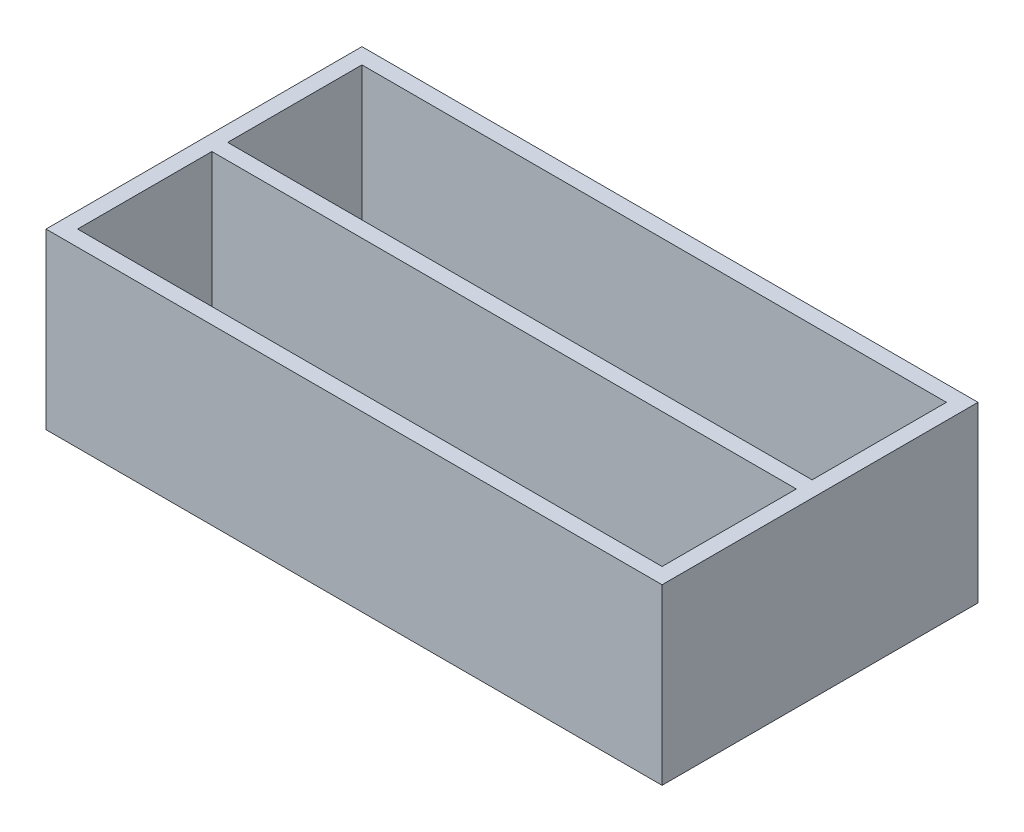
ISO-10303-21;
HEADER;
FILE_DESCRIPTION(('STEP AP214'),'2;1');
FILE_NAME('part.step','',(''),(''),'','','');
FILE_SCHEMA(('AUTOMOTIVE_DESIGN { 1 0 10303 214 1 1 1 1 }'));
ENDSEC;
DATA;
#1=APPLICATION_CONTEXT('core data for automotive mechanical design processes');
#2=APPLICATION_PROTOCOL_DEFINITION('international standard','automotive_design',2000,#1);
#3=PRODUCT_CONTEXT('',#1,'mechanical');
#4=PRODUCT('Part','Part','',(#3));
#5=PRODUCT_RELATED_PRODUCT_CATEGORY('part','',(#4));
#6=PRODUCT_DEFINITION_FORMATION('','',#4);
#7=PRODUCT_DEFINITION_CONTEXT('part definition',#1,'design');
#8=PRODUCT_DEFINITION('design','',#6,#7);
#9=PRODUCT_DEFINITION_SHAPE('','',#8);
#10=(LENGTH_UNIT() NAMED_UNIT(*) SI_UNIT(.MILLI.,.METRE.));
#11=(NAMED_UNIT(*) PLANE_ANGLE_UNIT() SI_UNIT($,.RADIAN.));
#12=(NAMED_UNIT(*) SI_UNIT($,.STERADIAN.) SOLID_ANGLE_UNIT());
#13=UNCERTAINTY_MEASURE_WITH_UNIT(LENGTH_MEASURE(1.E-05),#10,'distance_accuracy_value','');
#14=(GEOMETRIC_REPRESENTATION_CONTEXT(3) GLOBAL_UNCERTAINTY_ASSIGNED_CONTEXT((#13)) GLOBAL_UNIT_ASSIGNED_CONTEXT((#10,
#11,#12)) REPRESENTATION_CONTEXT('',''));
#15=CARTESIAN_POINT('',(0.,0.,0.));
#16=DIRECTION('',(0.,0.,1.));
#17=DIRECTION('',(1.,0.,0.));
#18=AXIS2_PLACEMENT_3D('',#15,#16,#17);
#19=CARTESIAN_POINT('',(0.,22.,0.));
#20=DIRECTION('',(-1.,0.,0.));
#21=DIRECTION('',(0.,0.,1.));
#22=AXIS2_PLACEMENT_3D('',#19,#20,#21);
#23=PLANE('',#22);
#24=DIRECTION('',(0.,0.,-1.));
#25=VECTOR('',#24,1.);
#26=CARTESIAN_POINT('',(0.,0.,0.));
#27=LINE('',#26,#25);
#28=CARTESIAN_POINT('',(0.,0.,0.));
#29=VERTEX_POINT('',#28);
#30=CARTESIAN_POINT('',(0.,0.,-40.));
#31=VERTEX_POINT('',#30);
#32=EDGE_CURVE('E156',#29,#31,#27,.T.);
#33=ORIENTED_EDGE('',*,*,#32,.T.);
#34=DIRECTION('',(0.,-1.,0.));
#35=VECTOR('',#34,1.);
#36=CARTESIAN_POINT('',(0.,22.,-40.));
#37=LINE('',#36,#35);
#38=CARTESIAN_POINT('',(0.,22.,-40.));
#39=VERTEX_POINT('',#38);
#40=EDGE_CURVE('E11',#39,#31,#37,.T.);
#41=ORIENTED_EDGE('',*,*,#40,.F.);
#42=DIRECTION('',(0.,0.,-1.));
#43=VECTOR('',#42,1.);
#44=CARTESIAN_POINT('',(0.,22.,0.));
#45=LINE('',#44,#43);
#46=CARTESIAN_POINT('',(0.,22.,0.));
#47=VERTEX_POINT('',#46);
#48=EDGE_CURVE('E188',#47,#39,#45,.T.);
#49=ORIENTED_EDGE('',*,*,#48,.F.);
#50=DIRECTION('',(0.,-1.,0.));
#51=VECTOR('',#50,1.);
#52=CARTESIAN_POINT('',(0.,22.,0.));
#53=LINE('',#52,#51);
#54=EDGE_CURVE('E198',#47,#29,#53,.T.);
#55=ORIENTED_EDGE('',*,*,#54,.T.);
#56=EDGE_LOOP('',(#33,#41,#49,#55));
#57=FACE_BOUND('',#56,.T.);
#58=ADVANCED_FACE('F32',(#57),#23,.F.);
#59=CARTESIAN_POINT('',(0.,22.,-40.));
#60=DIRECTION('',(0.,0.,1.));
#61=DIRECTION('',(1.,0.,0.));
#62=AXIS2_PLACEMENT_3D('',#59,#60,#61);
#63=PLANE('',#62);
#64=DIRECTION('',(-1.,0.,0.));
#65=VECTOR('',#64,1.);
#66=CARTESIAN_POINT('',(0.,0.,-40.));
#67=LINE('',#66,#65);
#68=CARTESIAN_POINT('',(-78.,0.,-40.));
#69=VERTEX_POINT('',#68);
#70=EDGE_CURVE('E201',#31,#69,#67,.T.);
#71=ORIENTED_EDGE('',*,*,#70,.T.);
#72=DIRECTION('',(0.,-1.,0.));
#73=VECTOR('',#72,1.);
#74=CARTESIAN_POINT('',(-78.,22.,-40.));
#75=LINE('',#74,#73);
#76=CARTESIAN_POINT('',(-78.,22.,-40.));
#77=VERTEX_POINT('',#76);
#78=EDGE_CURVE('E39',#77,#69,#75,.T.);
#79=ORIENTED_EDGE('',*,*,#78,.F.);
#80=DIRECTION('',(-1.,0.,0.));
#81=VECTOR('',#80,1.);
#82=CARTESIAN_POINT('',(0.,22.,-40.));
#83=LINE('',#82,#81);
#84=EDGE_CURVE('E191',#39,#77,#83,.T.);
#85=ORIENTED_EDGE('',*,*,#84,.F.);
#86=ORIENTED_EDGE('',*,*,#40,.T.);
#87=EDGE_LOOP('',(#71,#79,#85,#86));
#88=FACE_BOUND('',#87,.T.);
#89=ADVANCED_FACE('F231',(#88),#63,.F.);
#90=CARTESIAN_POINT('',(-78.,22.,0.));
#91=DIRECTION('',(1.,0.,0.));
#92=DIRECTION('',(0.,0.,-1.));
#93=AXIS2_PLACEMENT_3D('',#90,#91,#92);
#94=PLANE('',#93);
#95=DIRECTION('',(0.,0.,1.));
#96=VECTOR('',#95,1.);
#97=CARTESIAN_POINT('',(-78.,0.,0.));
#98=LINE('',#97,#96);
#99=CARTESIAN_POINT('',(-78.,0.,0.));
#100=VERTEX_POINT('',#99);
#101=EDGE_CURVE('E203',#69,#100,#98,.T.);
#102=ORIENTED_EDGE('',*,*,#101,.T.);
#103=DIRECTION('',(0.,-1.,0.));
#104=VECTOR('',#103,1.);
#105=CARTESIAN_POINT('',(-78.,22.,0.));
#106=LINE('',#105,#104);
#107=CARTESIAN_POINT('',(-78.,22.,0.));
#108=VERTEX_POINT('',#107);
#109=EDGE_CURVE('E208',#108,#100,#106,.T.);
#110=ORIENTED_EDGE('',*,*,#109,.F.);
#111=DIRECTION('',(0.,0.,1.));
#112=VECTOR('',#111,1.);
#113=CARTESIAN_POINT('',(-78.,22.,0.));
#114=LINE('',#113,#112);
#115=EDGE_CURVE('E194',#77,#108,#114,.T.);
#116=ORIENTED_EDGE('',*,*,#115,.F.);
#117=ORIENTED_EDGE('',*,*,#78,.T.);
#118=EDGE_LOOP('',(#102,#110,#116,#117));
#119=FACE_BOUND('',#118,.T.);
#120=ADVANCED_FACE('F215',(#119),#94,.F.);
#121=CARTESIAN_POINT('',(0.,22.,0.));
#122=DIRECTION('',(0.,0.,-1.));
#123=DIRECTION('',(-1.,0.,0.));
#124=AXIS2_PLACEMENT_3D('',#121,#122,#123);
#125=PLANE('',#124);
#126=DIRECTION('',(1.,0.,0.));
#127=VECTOR('',#126,1.);
#128=CARTESIAN_POINT('',(0.,0.,0.));
#129=LINE('',#128,#127);
#130=EDGE_CURVE('E192',#100,#29,#129,.T.);
#131=ORIENTED_EDGE('',*,*,#130,.T.);
#132=ORIENTED_EDGE('',*,*,#54,.F.);
#133=DIRECTION('',(1.,0.,0.));
#134=VECTOR('',#133,1.);
#135=CARTESIAN_POINT('',(0.,22.,0.));
#136=LINE('',#135,#134);
#137=EDGE_CURVE('E196',#108,#47,#136,.T.);
#138=ORIENTED_EDGE('',*,*,#137,.F.);
#139=ORIENTED_EDGE('',*,*,#109,.T.);
#140=EDGE_LOOP('',(#131,#132,#138,#139));
#141=FACE_BOUND('',#140,.T.);
#142=ADVANCED_FACE('F224',(#141),#125,.F.);
#143=CARTESIAN_POINT('',(0.,22.,0.));
#144=DIRECTION('',(0.,1.,0.));
#145=DIRECTION('',(0.,0.,1.));
#146=AXIS2_PLACEMENT_3D('',#143,#144,#145);
#147=PLANE('',#146);
#148=DIRECTION('',(-1.,0.,0.));
#149=VECTOR('',#148,1.);
#150=CARTESIAN_POINT('',(0.,22.,-38.));
#151=LINE('',#150,#149);
#152=CARTESIAN_POINT('',(-2.,22.,-38.));
#153=VERTEX_POINT('',#152);
#154=CARTESIAN_POINT('',(-76.,22.,-38.));
#155=VERTEX_POINT('',#154);
#156=EDGE_CURVE('E46',#153,#155,#151,.T.);
#157=ORIENTED_EDGE('',*,*,#156,.F.);
#158=DIRECTION('',(0.,0.,-1.));
#159=VECTOR('',#158,1.);
#160=CARTESIAN_POINT('',(-2.,22.,0.));
#161=LINE('',#160,#159);
#162=CARTESIAN_POINT('',(-2.,22.,-21.));
#163=VERTEX_POINT('',#162);
#164=EDGE_CURVE('E140',#163,#153,#161,.T.);
#165=ORIENTED_EDGE('',*,*,#164,.F.);
#166=DIRECTION('',(1.,0.,0.));
#167=VECTOR('',#166,1.);
#168=CARTESIAN_POINT('',(0.,22.,-21.));
#169=LINE('',#168,#167);
#170=CARTESIAN_POINT('',(-76.,22.,-21.));
#171=VERTEX_POINT('',#170);
#172=EDGE_CURVE('E143',#171,#163,#169,.T.);
#173=ORIENTED_EDGE('',*,*,#172,.F.);
#174=DIRECTION('',(0.,0.,1.));
#175=VECTOR('',#174,1.);
#176=CARTESIAN_POINT('',(-76.,22.,0.));
#177=LINE('',#176,#175);
#178=EDGE_CURVE('E149',#155,#171,#177,.T.);
#179=ORIENTED_EDGE('',*,*,#178,.F.);
#180=EDGE_LOOP('',(#157,#165,#173,#179));
#181=FACE_BOUND('',#180,.T.);
#182=DIRECTION('',(0.,0.,1.));
#183=VECTOR('',#182,1.);
#184=CARTESIAN_POINT('',(-76.,22.,0.));
#185=LINE('',#184,#183);
#186=CARTESIAN_POINT('',(-76.,22.,-19.));
#187=VERTEX_POINT('',#186);
#188=CARTESIAN_POINT('',(-76.,22.,-2.));
#189=VERTEX_POINT('',#188);
#190=EDGE_CURVE('E54',#187,#189,#185,.T.);
#191=ORIENTED_EDGE('',*,*,#190,.F.);
#192=DIRECTION('',(1.,0.,0.));
#193=VECTOR('',#192,1.);
#194=CARTESIAN_POINT('',(0.,22.,-19.));
#195=LINE('',#194,#193);
#196=CARTESIAN_POINT('',(-2.,22.,-19.));
#197=VERTEX_POINT('',#196);
#198=EDGE_CURVE('E164',#187,#197,#195,.T.);
#199=ORIENTED_EDGE('',*,*,#198,.T.);
#200=DIRECTION('',(0.,0.,-1.));
#201=VECTOR('',#200,1.);
#202=CARTESIAN_POINT('',(-2.,22.,0.));
#203=LINE('',#202,#201);
#204=CARTESIAN_POINT('',(-2.,22.,-2.));
#205=VERTEX_POINT('',#204);
#206=EDGE_CURVE('E177',#205,#197,#203,.T.);
#207=ORIENTED_EDGE('',*,*,#206,.F.);
#208=DIRECTION('',(1.,0.,0.));
#209=VECTOR('',#208,1.);
#210=CARTESIAN_POINT('',(0.,22.,-2.));
#211=LINE('',#210,#209);
#212=EDGE_CURVE('E174',#189,#205,#211,.T.);
#213=ORIENTED_EDGE('',*,*,#212,.F.);
#214=EDGE_LOOP('',(#191,#199,#207,#213));
#215=FACE_BOUND('',#214,.T.);
#216=ORIENTED_EDGE('',*,*,#48,.T.);
#217=ORIENTED_EDGE('',*,*,#84,.T.);
#218=ORIENTED_EDGE('',*,*,#115,.T.);
#219=ORIENTED_EDGE('',*,*,#137,.T.);
#220=EDGE_LOOP('',(#216,#217,#218,#219));
#221=FACE_BOUND('',#220,.T.);
#222=ADVANCED_FACE('F230',(#181,#215,#221),#147,.T.);
#223=CARTESIAN_POINT('',(0.,0.,0.));
#224=DIRECTION('',(0.,1.,0.));
#225=DIRECTION('',(0.,0.,1.));
#226=AXIS2_PLACEMENT_3D('',#223,#224,#225);
#227=PLANE('',#226);
#228=ORIENTED_EDGE('',*,*,#32,.F.);
#229=ORIENTED_EDGE('',*,*,#130,.F.);
#230=ORIENTED_EDGE('',*,*,#101,.F.);
#231=ORIENTED_EDGE('',*,*,#70,.F.);
#232=EDGE_LOOP('',(#228,#229,#230,#231));
#233=FACE_BOUND('',#232,.T.);
#234=ADVANCED_FACE('F221',(#233),#227,.F.);
#235=CARTESIAN_POINT('',(-76.,2.,0.));
#236=DIRECTION('',(-1.,0.,0.));
#237=DIRECTION('',(0.,0.,1.));
#238=AXIS2_PLACEMENT_3D('',#235,#236,#237);
#239=PLANE('',#238);
#240=ORIENTED_EDGE('',*,*,#190,.T.);
#241=DIRECTION('',(0.,1.,0.));
#242=VECTOR('',#241,1.);
#243=CARTESIAN_POINT('',(-76.,2.,-2.));
#244=LINE('',#243,#242);
#245=CARTESIAN_POINT('',(-76.,2.,-2.));
#246=VERTEX_POINT('',#245);
#247=EDGE_CURVE('E172',#246,#189,#244,.T.);
#248=ORIENTED_EDGE('',*,*,#247,.F.);
#249=DIRECTION('',(0.,0.,1.));
#250=VECTOR('',#249,1.);
#251=CARTESIAN_POINT('',(-76.,2.,0.));
#252=LINE('',#251,#250);
#253=CARTESIAN_POINT('',(-76.,2.,-19.));
#254=VERTEX_POINT('',#253);
#255=EDGE_CURVE('E160',#254,#246,#252,.T.);
#256=ORIENTED_EDGE('',*,*,#255,.F.);
#257=DIRECTION('',(0.,1.,0.));
#258=VECTOR('',#257,1.);
#259=CARTESIAN_POINT('',(-76.,2.,-19.));
#260=LINE('',#259,#258);
#261=EDGE_CURVE('E150',#254,#187,#260,.T.);
#262=ORIENTED_EDGE('',*,*,#261,.T.);
#263=EDGE_LOOP('',(#240,#248,#256,#262));
#264=FACE_BOUND('',#263,.T.);
#265=ADVANCED_FACE('F243',(#264),#239,.F.);
#266=CARTESIAN_POINT('',(0.,2.,-19.));
#267=DIRECTION('',(0.,0.,1.));
#268=DIRECTION('',(1.,0.,0.));
#269=AXIS2_PLACEMENT_3D('',#266,#267,#268);
#270=PLANE('',#269);
#271=ORIENTED_EDGE('',*,*,#198,.F.);
#272=ORIENTED_EDGE('',*,*,#261,.F.);
#273=DIRECTION('',(1.,0.,0.));
#274=VECTOR('',#273,1.);
#275=CARTESIAN_POINT('',(0.,2.,-19.));
#276=LINE('',#275,#274);
#277=CARTESIAN_POINT('',(-2.,2.,-19.));
#278=VERTEX_POINT('',#277);
#279=EDGE_CURVE('E170',#254,#278,#276,.T.);
#280=ORIENTED_EDGE('',*,*,#279,.T.);
#281=DIRECTION('',(0.,1.,0.));
#282=VECTOR('',#281,1.);
#283=CARTESIAN_POINT('',(-2.,2.,-19.));
#284=LINE('',#283,#282);
#285=EDGE_CURVE('E183',#278,#197,#284,.T.);
#286=ORIENTED_EDGE('',*,*,#285,.T.);
#287=EDGE_LOOP('',(#271,#272,#280,#286));
#288=FACE_BOUND('',#287,.T.);
#289=ADVANCED_FACE('F249',(#288),#270,.T.);
#290=CARTESIAN_POINT('',(-2.,2.,0.));
#291=DIRECTION('',(1.,0.,0.));
#292=DIRECTION('',(0.,0.,-1.));
#293=AXIS2_PLACEMENT_3D('',#290,#291,#292);
#294=PLANE('',#293);
#295=ORIENTED_EDGE('',*,*,#206,.T.);
#296=ORIENTED_EDGE('',*,*,#285,.F.);
#297=DIRECTION('',(0.,0.,-1.));
#298=VECTOR('',#297,1.);
#299=CARTESIAN_POINT('',(-2.,2.,0.));
#300=LINE('',#299,#298);
#301=CARTESIAN_POINT('',(-2.,2.,-2.));
#302=VERTEX_POINT('',#301);
#303=EDGE_CURVE('E167',#302,#278,#300,.T.);
#304=ORIENTED_EDGE('',*,*,#303,.F.);
#305=DIRECTION('',(0.,1.,0.));
#306=VECTOR('',#305,1.);
#307=CARTESIAN_POINT('',(-2.,2.,-2.));
#308=LINE('',#307,#306);
#309=EDGE_CURVE('E185',#302,#205,#308,.T.);
#310=ORIENTED_EDGE('',*,*,#309,.T.);
#311=EDGE_LOOP('',(#295,#296,#304,#310));
#312=FACE_BOUND('',#311,.T.);
#313=ADVANCED_FACE('F254',(#312),#294,.F.);
#314=CARTESIAN_POINT('',(0.,2.,-2.));
#315=DIRECTION('',(0.,0.,1.));
#316=DIRECTION('',(1.,0.,0.));
#317=AXIS2_PLACEMENT_3D('',#314,#315,#316);
#318=PLANE('',#317);
#319=ORIENTED_EDGE('',*,*,#212,.T.);
#320=ORIENTED_EDGE('',*,*,#309,.F.);
#321=DIRECTION('',(1.,0.,0.));
#322=VECTOR('',#321,1.);
#323=CARTESIAN_POINT('',(0.,2.,-2.));
#324=LINE('',#323,#322);
#325=EDGE_CURVE('E163',#246,#302,#324,.T.);
#326=ORIENTED_EDGE('',*,*,#325,.F.);
#327=ORIENTED_EDGE('',*,*,#247,.T.);
#328=EDGE_LOOP('',(#319,#320,#326,#327));
#329=FACE_BOUND('',#328,.T.);
#330=ADVANCED_FACE('F250',(#329),#318,.F.);
#331=CARTESIAN_POINT('',(0.,2.,0.));
#332=DIRECTION('',(0.,1.,0.));
#333=DIRECTION('',(0.,0.,1.));
#334=AXIS2_PLACEMENT_3D('',#331,#332,#333);
#335=PLANE('',#334);
#336=ORIENTED_EDGE('',*,*,#255,.T.);
#337=ORIENTED_EDGE('',*,*,#325,.T.);
#338=ORIENTED_EDGE('',*,*,#303,.T.);
#339=ORIENTED_EDGE('',*,*,#279,.F.);
#340=EDGE_LOOP('',(#336,#337,#338,#339));
#341=FACE_BOUND('',#340,.T.);
#342=ADVANCED_FACE('F253',(#341),#335,.T.);
#343=CARTESIAN_POINT('',(0.,2.,-38.));
#344=DIRECTION('',(0.,0.,-1.));
#345=DIRECTION('',(-1.,0.,0.));
#346=AXIS2_PLACEMENT_3D('',#343,#344,#345);
#347=PLANE('',#346);
#348=ORIENTED_EDGE('',*,*,#156,.T.);
#349=DIRECTION('',(0.,1.,0.));
#350=VECTOR('',#349,1.);
#351=CARTESIAN_POINT('',(-76.,2.,-38.));
#352=LINE('',#351,#350);
#353=CARTESIAN_POINT('',(-76.,2.,-38.));
#354=VERTEX_POINT('',#353);
#355=EDGE_CURVE('E118',#354,#155,#352,.T.);
#356=ORIENTED_EDGE('',*,*,#355,.F.);
#357=DIRECTION('',(-1.,0.,0.));
#358=VECTOR('',#357,1.);
#359=CARTESIAN_POINT('',(0.,2.,-38.));
#360=LINE('',#359,#358);
#361=CARTESIAN_POINT('',(-2.,2.,-38.));
#362=VERTEX_POINT('',#361);
#363=EDGE_CURVE('E122',#362,#354,#360,.T.);
#364=ORIENTED_EDGE('',*,*,#363,.F.);
#365=DIRECTION('',(0.,1.,0.));
#366=VECTOR('',#365,1.);
#367=CARTESIAN_POINT('',(-2.,2.,-38.));
#368=LINE('',#367,#366);
#369=EDGE_CURVE('E154',#362,#153,#368,.T.);
#370=ORIENTED_EDGE('',*,*,#369,.T.);
#371=EDGE_LOOP('',(#348,#356,#364,#370));
#372=FACE_BOUND('',#371,.T.);
#373=ADVANCED_FACE('F120',(#372),#347,.F.);
#374=CARTESIAN_POINT('',(-2.,2.,0.));
#375=DIRECTION('',(1.,0.,0.));
#376=DIRECTION('',(0.,0.,-1.));
#377=AXIS2_PLACEMENT_3D('',#374,#375,#376);
#378=PLANE('',#377);
#379=ORIENTED_EDGE('',*,*,#164,.T.);
#380=ORIENTED_EDGE('',*,*,#369,.F.);
#381=DIRECTION('',(0.,0.,-1.));
#382=VECTOR('',#381,1.);
#383=CARTESIAN_POINT('',(-2.,2.,0.));
#384=LINE('',#383,#382);
#385=CARTESIAN_POINT('',(-2.,2.,-21.));
#386=VERTEX_POINT('',#385);
#387=EDGE_CURVE('E128',#386,#362,#384,.T.);
#388=ORIENTED_EDGE('',*,*,#387,.F.);
#389=DIRECTION('',(0.,1.,0.));
#390=VECTOR('',#389,1.);
#391=CARTESIAN_POINT('',(-2.,2.,-21.));
#392=LINE('',#391,#390);
#393=EDGE_CURVE('E157',#386,#163,#392,.T.);
#394=ORIENTED_EDGE('',*,*,#393,.T.);
#395=EDGE_LOOP('',(#379,#380,#388,#394));
#396=FACE_BOUND('',#395,.T.);
#397=ADVANCED_FACE('F267',(#396),#378,.F.);
#398=CARTESIAN_POINT('',(0.,2.,-21.));
#399=DIRECTION('',(0.,0.,1.));
#400=DIRECTION('',(1.,0.,0.));
#401=AXIS2_PLACEMENT_3D('',#398,#399,#400);
#402=PLANE('',#401);
#403=ORIENTED_EDGE('',*,*,#172,.T.);
#404=ORIENTED_EDGE('',*,*,#393,.F.);
#405=DIRECTION('',(1.,0.,0.));
#406=VECTOR('',#405,1.);
#407=CARTESIAN_POINT('',(0.,2.,-21.));
#408=LINE('',#407,#406);
#409=CARTESIAN_POINT('',(-76.,2.,-21.));
#410=VERTEX_POINT('',#409);
#411=EDGE_CURVE('E136',#410,#386,#408,.T.);
#412=ORIENTED_EDGE('',*,*,#411,.F.);
#413=DIRECTION('',(0.,1.,0.));
#414=VECTOR('',#413,1.);
#415=CARTESIAN_POINT('',(-76.,2.,-21.));
#416=LINE('',#415,#414);
#417=EDGE_CURVE('E127',#410,#171,#416,.T.);
#418=ORIENTED_EDGE('',*,*,#417,.T.);
#419=EDGE_LOOP('',(#403,#404,#412,#418));
#420=FACE_BOUND('',#419,.T.);
#421=ADVANCED_FACE('F270',(#420),#402,.F.);
#422=CARTESIAN_POINT('',(-76.,2.,0.));
#423=DIRECTION('',(-1.,0.,0.));
#424=DIRECTION('',(0.,0.,1.));
#425=AXIS2_PLACEMENT_3D('',#422,#423,#424);
#426=PLANE('',#425);
#427=ORIENTED_EDGE('',*,*,#178,.T.);
#428=ORIENTED_EDGE('',*,*,#417,.F.);
#429=DIRECTION('',(0.,0.,1.));
#430=VECTOR('',#429,1.);
#431=CARTESIAN_POINT('',(-76.,2.,0.));
#432=LINE('',#431,#430);
#433=EDGE_CURVE('E131',#354,#410,#432,.T.);
#434=ORIENTED_EDGE('',*,*,#433,.F.);
#435=ORIENTED_EDGE('',*,*,#355,.T.);
#436=EDGE_LOOP('',(#427,#428,#434,#435));
#437=FACE_BOUND('',#436,.T.);
#438=ADVANCED_FACE('F132',(#437),#426,.F.);
#439=CARTESIAN_POINT('',(0.,2.,0.));
#440=DIRECTION('',(0.,1.,0.));
#441=DIRECTION('',(0.,0.,1.));
#442=AXIS2_PLACEMENT_3D('',#439,#440,#441);
#443=PLANE('',#442);
#444=ORIENTED_EDGE('',*,*,#363,.T.);
#445=ORIENTED_EDGE('',*,*,#433,.T.);
#446=ORIENTED_EDGE('',*,*,#411,.T.);
#447=ORIENTED_EDGE('',*,*,#387,.T.);
#448=EDGE_LOOP('',(#444,#445,#446,#447));
#449=FACE_BOUND('',#448,.T.);
#450=ADVANCED_FACE('F138',(#449),#443,.T.);
#451=CLOSED_SHELL('',(#58,#89,#120,#142,#222,#234,#265,#289,#313,#330,#342,#373,#397,#421,#438,#450));
#452=MANIFOLD_SOLID_BREP('B2',#451);
#453=ADVANCED_BREP_SHAPE_REPRESENTATION('',(#18,#452),#14);
#454=SHAPE_DEFINITION_REPRESENTATION(#9,#453);
ENDSEC;
END-ISO-10303-21;
